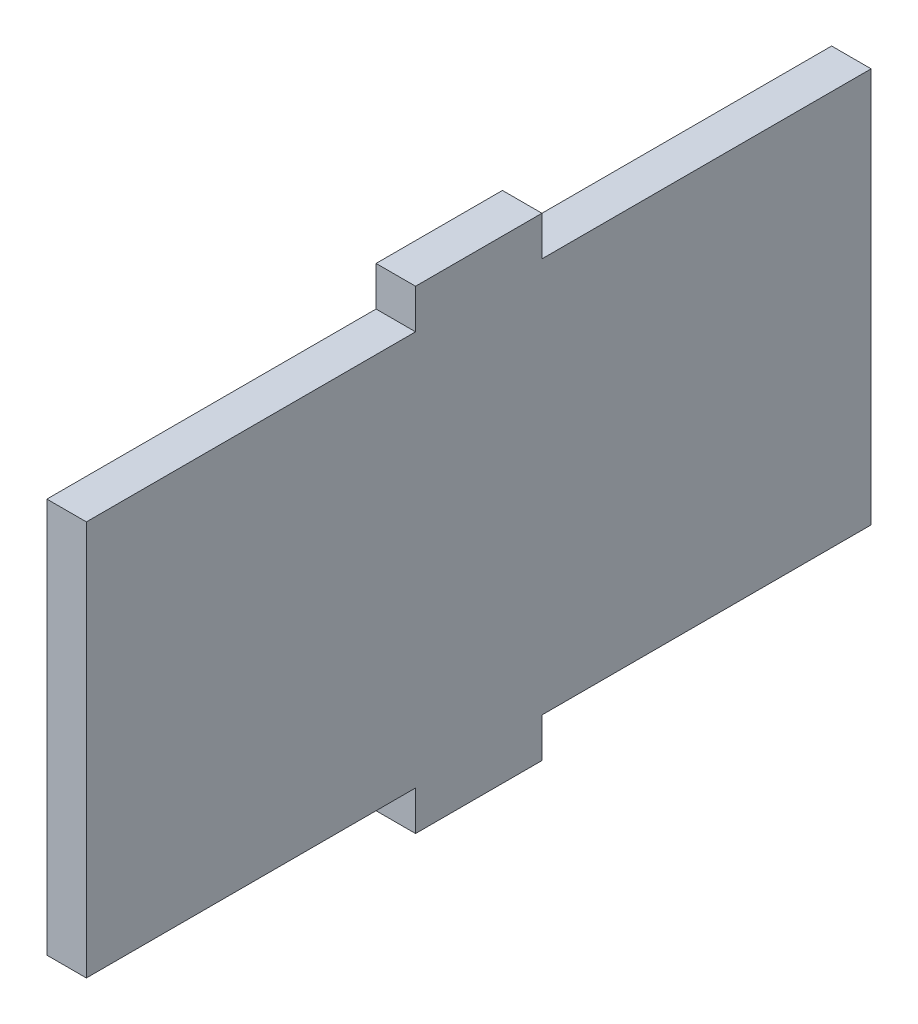
ISO-10303-21;
HEADER;
FILE_DESCRIPTION(('STEP AP214'),'2;1');
FILE_NAME('part.step','',(''),(''),'','','');
FILE_SCHEMA(('AUTOMOTIVE_DESIGN { 1 0 10303 214 1 1 1 1 }'));
ENDSEC;
DATA;
#1=APPLICATION_CONTEXT('core data for automotive mechanical design processes');
#2=APPLICATION_PROTOCOL_DEFINITION('international standard','automotive_design',2000,#1);
#3=PRODUCT_CONTEXT('',#1,'mechanical');
#4=PRODUCT('Part','Part','',(#3));
#5=PRODUCT_RELATED_PRODUCT_CATEGORY('part','',(#4));
#6=PRODUCT_DEFINITION_FORMATION('','',#4);
#7=PRODUCT_DEFINITION_CONTEXT('part definition',#1,'design');
#8=PRODUCT_DEFINITION('design','',#6,#7);
#9=PRODUCT_DEFINITION_SHAPE('','',#8);
#10=(LENGTH_UNIT() NAMED_UNIT(*) SI_UNIT(.MILLI.,.METRE.));
#11=(NAMED_UNIT(*) PLANE_ANGLE_UNIT() SI_UNIT($,.RADIAN.));
#12=(NAMED_UNIT(*) SI_UNIT($,.STERADIAN.) SOLID_ANGLE_UNIT());
#13=UNCERTAINTY_MEASURE_WITH_UNIT(LENGTH_MEASURE(1.E-05),#10,'distance_accuracy_value','');
#14=(GEOMETRIC_REPRESENTATION_CONTEXT(3) GLOBAL_UNCERTAINTY_ASSIGNED_CONTEXT((#13)) GLOBAL_UNIT_ASSIGNED_CONTEXT((#10,
#11,#12)) REPRESENTATION_CONTEXT('',''));
#15=CARTESIAN_POINT('',(0.,0.,0.));
#16=DIRECTION('',(0.,0.,1.));
#17=DIRECTION('',(1.,0.,0.));
#18=AXIS2_PLACEMENT_3D('',#15,#16,#17);
#19=CARTESIAN_POINT('',(3.,41.,-4.8));
#20=DIRECTION('',(0.,-1.,0.));
#21=DIRECTION('',(0.,0.,-1.));
#22=AXIS2_PLACEMENT_3D('',#19,#20,#21);
#23=PLANE('',#22);
#24=DIRECTION('',(0.,0.,1.));
#25=VECTOR('',#24,1.);
#26=CARTESIAN_POINT('',(0.,41.,-4.8));
#27=LINE('',#26,#25);
#28=CARTESIAN_POINT('',(0.,41.,-4.8));
#29=VERTEX_POINT('',#28);
#30=CARTESIAN_POINT('',(0.,41.,4.8));
#31=VERTEX_POINT('',#30);
#32=EDGE_CURVE('E157',#29,#31,#27,.T.);
#33=ORIENTED_EDGE('',*,*,#32,.T.);
#34=DIRECTION('',(-1.,0.,0.));
#35=VECTOR('',#34,1.);
#36=CARTESIAN_POINT('',(3.,41.,4.8));
#37=LINE('',#36,#35);
#38=CARTESIAN_POINT('',(3.,41.,4.8));
#39=VERTEX_POINT('',#38);
#40=EDGE_CURVE('E11',#39,#31,#37,.T.);
#41=ORIENTED_EDGE('',*,*,#40,.F.);
#42=DIRECTION('',(0.,0.,1.));
#43=VECTOR('',#42,1.);
#44=CARTESIAN_POINT('',(3.,41.,-4.8));
#45=LINE('',#44,#43);
#46=CARTESIAN_POINT('',(3.,41.,-4.8));
#47=VERTEX_POINT('',#46);
#48=EDGE_CURVE('E179',#47,#39,#45,.T.);
#49=ORIENTED_EDGE('',*,*,#48,.F.);
#50=DIRECTION('',(-1.,0.,0.));
#51=VECTOR('',#50,1.);
#52=CARTESIAN_POINT('',(3.,41.,-4.8));
#53=LINE('',#52,#51);
#54=EDGE_CURVE('E153',#47,#29,#53,.T.);
#55=ORIENTED_EDGE('',*,*,#54,.T.);
#56=EDGE_LOOP('',(#33,#41,#49,#55));
#57=FACE_BOUND('',#56,.T.);
#58=ADVANCED_FACE('F37',(#57),#23,.F.);
#59=CARTESIAN_POINT('',(3.,41.,4.8));
#60=DIRECTION('',(0.,0.,-1.));
#61=DIRECTION('',(-1.,0.,0.));
#62=AXIS2_PLACEMENT_3D('',#59,#60,#61);
#63=PLANE('',#62);
#64=DIRECTION('',(0.,-1.,0.));
#65=VECTOR('',#64,1.);
#66=CARTESIAN_POINT('',(0.,41.,4.8));
#67=LINE('',#66,#65);
#68=CARTESIAN_POINT('',(0.,38.,4.8));
#69=VERTEX_POINT('',#68);
#70=EDGE_CURVE('E160',#31,#69,#67,.T.);
#71=ORIENTED_EDGE('',*,*,#70,.T.);
#72=DIRECTION('',(-1.,0.,0.));
#73=VECTOR('',#72,1.);
#74=CARTESIAN_POINT('',(3.,38.,4.8));
#75=LINE('',#74,#73);
#76=CARTESIAN_POINT('',(3.,38.,4.8));
#77=VERTEX_POINT('',#76);
#78=EDGE_CURVE('E45',#77,#69,#75,.T.);
#79=ORIENTED_EDGE('',*,*,#78,.F.);
#80=DIRECTION('',(0.,-1.,0.));
#81=VECTOR('',#80,1.);
#82=CARTESIAN_POINT('',(3.,41.,4.8));
#83=LINE('',#82,#81);
#84=EDGE_CURVE('E108',#39,#77,#83,.T.);
#85=ORIENTED_EDGE('',*,*,#84,.F.);
#86=ORIENTED_EDGE('',*,*,#40,.T.);
#87=EDGE_LOOP('',(#71,#79,#85,#86));
#88=FACE_BOUND('',#87,.T.);
#89=ADVANCED_FACE('F257',(#88),#63,.F.);
#90=CARTESIAN_POINT('',(3.,38.,4.8));
#91=DIRECTION('',(0.,-1.,0.));
#92=DIRECTION('',(0.,0.,-1.));
#93=AXIS2_PLACEMENT_3D('',#90,#91,#92);
#94=PLANE('',#93);
#95=DIRECTION('',(0.,0.,1.));
#96=VECTOR('',#95,1.);
#97=CARTESIAN_POINT('',(0.,38.,4.8));
#98=LINE('',#97,#96);
#99=CARTESIAN_POINT('',(0.,38.,29.8));
#100=VERTEX_POINT('',#99);
#101=EDGE_CURVE('E162',#69,#100,#98,.T.);
#102=ORIENTED_EDGE('',*,*,#101,.T.);
#103=DIRECTION('',(-1.,0.,0.));
#104=VECTOR('',#103,1.);
#105=CARTESIAN_POINT('',(3.,38.,29.8));
#106=LINE('',#105,#104);
#107=CARTESIAN_POINT('',(3.,38.,29.8));
#108=VERTEX_POINT('',#107);
#109=EDGE_CURVE('E198',#108,#100,#106,.T.);
#110=ORIENTED_EDGE('',*,*,#109,.F.);
#111=DIRECTION('',(0.,0.,1.));
#112=VECTOR('',#111,1.);
#113=CARTESIAN_POINT('',(3.,38.,4.8));
#114=LINE('',#113,#112);
#115=EDGE_CURVE('E206',#77,#108,#114,.T.);
#116=ORIENTED_EDGE('',*,*,#115,.F.);
#117=ORIENTED_EDGE('',*,*,#78,.T.);
#118=EDGE_LOOP('',(#102,#110,#116,#117));
#119=FACE_BOUND('',#118,.T.);
#120=ADVANCED_FACE('F204',(#119),#94,.F.);
#121=CARTESIAN_POINT('',(3.,7.99999999999999,29.8));
#122=DIRECTION('',(0.,0.,-1.));
#123=DIRECTION('',(-1.,0.,0.));
#124=AXIS2_PLACEMENT_3D('',#121,#122,#123);
#125=PLANE('',#124);
#126=DIRECTION('',(0.,-1.,0.));
#127=VECTOR('',#126,1.);
#128=CARTESIAN_POINT('',(0.,7.99999999999999,29.8));
#129=LINE('',#128,#127);
#130=CARTESIAN_POINT('',(0.,7.99999999999999,29.8));
#131=VERTEX_POINT('',#130);
#132=EDGE_CURVE('E164',#100,#131,#129,.T.);
#133=ORIENTED_EDGE('',*,*,#132,.T.);
#134=DIRECTION('',(-1.,0.,0.));
#135=VECTOR('',#134,1.);
#136=CARTESIAN_POINT('',(3.,7.99999999999999,29.8));
#137=LINE('',#136,#135);
#138=CARTESIAN_POINT('',(3.,7.99999999999999,29.8));
#139=VERTEX_POINT('',#138);
#140=EDGE_CURVE('E195',#139,#131,#137,.T.);
#141=ORIENTED_EDGE('',*,*,#140,.F.);
#142=DIRECTION('',(0.,-1.,0.));
#143=VECTOR('',#142,1.);
#144=CARTESIAN_POINT('',(3.,7.99999999999999,29.8));
#145=LINE('',#144,#143);
#146=EDGE_CURVE('E224',#108,#139,#145,.T.);
#147=ORIENTED_EDGE('',*,*,#146,.F.);
#148=ORIENTED_EDGE('',*,*,#109,.T.);
#149=EDGE_LOOP('',(#133,#141,#147,#148));
#150=FACE_BOUND('',#149,.T.);
#151=ADVANCED_FACE('F215',(#150),#125,.F.);
#152=CARTESIAN_POINT('',(3.,7.99999999999999,4.8));
#153=DIRECTION('',(0.,1.,0.));
#154=DIRECTION('',(0.,0.,1.));
#155=AXIS2_PLACEMENT_3D('',#152,#153,#154);
#156=PLANE('',#155);
#157=DIRECTION('',(0.,0.,-1.));
#158=VECTOR('',#157,1.);
#159=CARTESIAN_POINT('',(0.,7.99999999999999,4.8));
#160=LINE('',#159,#158);
#161=CARTESIAN_POINT('',(0.,7.99999999999999,4.8));
#162=VERTEX_POINT('',#161);
#163=EDGE_CURVE('E166',#131,#162,#160,.T.);
#164=ORIENTED_EDGE('',*,*,#163,.T.);
#165=DIRECTION('',(-1.,0.,0.));
#166=VECTOR('',#165,1.);
#167=CARTESIAN_POINT('',(3.,7.99999999999999,4.8));
#168=LINE('',#167,#166);
#169=CARTESIAN_POINT('',(3.,7.99999999999999,4.8));
#170=VERTEX_POINT('',#169);
#171=EDGE_CURVE('E192',#170,#162,#168,.T.);
#172=ORIENTED_EDGE('',*,*,#171,.F.);
#173=DIRECTION('',(0.,0.,-1.));
#174=VECTOR('',#173,1.);
#175=CARTESIAN_POINT('',(3.,7.99999999999999,4.8));
#176=LINE('',#175,#174);
#177=EDGE_CURVE('E221',#139,#170,#176,.T.);
#178=ORIENTED_EDGE('',*,*,#177,.F.);
#179=ORIENTED_EDGE('',*,*,#140,.T.);
#180=EDGE_LOOP('',(#164,#172,#178,#179));
#181=FACE_BOUND('',#180,.T.);
#182=ADVANCED_FACE('F219',(#181),#156,.F.);
#183=CARTESIAN_POINT('',(3.,4.99999999999999,4.8));
#184=DIRECTION('',(0.,0.,-1.));
#185=DIRECTION('',(-1.,0.,0.));
#186=AXIS2_PLACEMENT_3D('',#183,#184,#185);
#187=PLANE('',#186);
#188=DIRECTION('',(0.,-1.,0.));
#189=VECTOR('',#188,1.);
#190=CARTESIAN_POINT('',(0.,4.99999999999999,4.8));
#191=LINE('',#190,#189);
#192=CARTESIAN_POINT('',(0.,4.99999999999999,4.8));
#193=VERTEX_POINT('',#192);
#194=EDGE_CURVE('E168',#162,#193,#191,.T.);
#195=ORIENTED_EDGE('',*,*,#194,.T.);
#196=DIRECTION('',(-1.,0.,0.));
#197=VECTOR('',#196,1.);
#198=CARTESIAN_POINT('',(3.,4.99999999999999,4.8));
#199=LINE('',#198,#197);
#200=CARTESIAN_POINT('',(3.,4.99999999999999,4.8));
#201=VERTEX_POINT('',#200);
#202=EDGE_CURVE('E189',#201,#193,#199,.T.);
#203=ORIENTED_EDGE('',*,*,#202,.F.);
#204=DIRECTION('',(0.,-1.,0.));
#205=VECTOR('',#204,1.);
#206=CARTESIAN_POINT('',(3.,4.99999999999999,4.8));
#207=LINE('',#206,#205);
#208=EDGE_CURVE('E223',#170,#201,#207,.T.);
#209=ORIENTED_EDGE('',*,*,#208,.F.);
#210=ORIENTED_EDGE('',*,*,#171,.T.);
#211=EDGE_LOOP('',(#195,#203,#209,#210));
#212=FACE_BOUND('',#211,.T.);
#213=ADVANCED_FACE('F270',(#212),#187,.F.);
#214=CARTESIAN_POINT('',(3.,5.,-4.8));
#215=DIRECTION('',(0.,1.,0.));
#216=DIRECTION('',(0.,0.,1.));
#217=AXIS2_PLACEMENT_3D('',#214,#215,#216);
#218=PLANE('',#217);
#219=DIRECTION('',(0.,0.,-1.));
#220=VECTOR('',#219,1.);
#221=CARTESIAN_POINT('',(0.,5.,-4.8));
#222=LINE('',#221,#220);
#223=CARTESIAN_POINT('',(0.,5.,-4.8));
#224=VERTEX_POINT('',#223);
#225=EDGE_CURVE('E170',#193,#224,#222,.T.);
#226=ORIENTED_EDGE('',*,*,#225,.T.);
#227=DIRECTION('',(-1.,0.,0.));
#228=VECTOR('',#227,1.);
#229=CARTESIAN_POINT('',(3.,5.,-4.8));
#230=LINE('',#229,#228);
#231=CARTESIAN_POINT('',(3.,5.,-4.8));
#232=VERTEX_POINT('',#231);
#233=EDGE_CURVE('E186',#232,#224,#230,.T.);
#234=ORIENTED_EDGE('',*,*,#233,.F.);
#235=DIRECTION('',(0.,0.,-1.));
#236=VECTOR('',#235,1.);
#237=CARTESIAN_POINT('',(3.,5.,-4.8));
#238=LINE('',#237,#236);
#239=EDGE_CURVE('E226',#201,#232,#238,.T.);
#240=ORIENTED_EDGE('',*,*,#239,.F.);
#241=ORIENTED_EDGE('',*,*,#202,.T.);
#242=EDGE_LOOP('',(#226,#234,#240,#241));
#243=FACE_BOUND('',#242,.T.);
#244=ADVANCED_FACE('F273',(#243),#218,.F.);
#245=CARTESIAN_POINT('',(3.,5.,-4.8));
#246=DIRECTION('',(0.,0.,1.));
#247=DIRECTION('',(1.,0.,0.));
#248=AXIS2_PLACEMENT_3D('',#245,#246,#247);
#249=PLANE('',#248);
#250=DIRECTION('',(0.,1.,0.));
#251=VECTOR('',#250,1.);
#252=CARTESIAN_POINT('',(0.,5.,-4.8));
#253=LINE('',#252,#251);
#254=CARTESIAN_POINT('',(0.,8.,-4.8));
#255=VERTEX_POINT('',#254);
#256=EDGE_CURVE('E172',#224,#255,#253,.T.);
#257=ORIENTED_EDGE('',*,*,#256,.T.);
#258=DIRECTION('',(-1.,0.,0.));
#259=VECTOR('',#258,1.);
#260=CARTESIAN_POINT('',(3.,8.,-4.8));
#261=LINE('',#260,#259);
#262=CARTESIAN_POINT('',(3.,8.,-4.8));
#263=VERTEX_POINT('',#262);
#264=EDGE_CURVE('E183',#263,#255,#261,.T.);
#265=ORIENTED_EDGE('',*,*,#264,.F.);
#266=DIRECTION('',(0.,1.,0.));
#267=VECTOR('',#266,1.);
#268=CARTESIAN_POINT('',(3.,5.,-4.8));
#269=LINE('',#268,#267);
#270=EDGE_CURVE('E232',#232,#263,#269,.T.);
#271=ORIENTED_EDGE('',*,*,#270,.F.);
#272=ORIENTED_EDGE('',*,*,#233,.T.);
#273=EDGE_LOOP('',(#257,#265,#271,#272));
#274=FACE_BOUND('',#273,.T.);
#275=ADVANCED_FACE('F238',(#274),#249,.F.);
#276=CARTESIAN_POINT('',(3.,8.,-4.8));
#277=DIRECTION('',(0.,1.,0.));
#278=DIRECTION('',(0.,0.,1.));
#279=AXIS2_PLACEMENT_3D('',#276,#277,#278);
#280=PLANE('',#279);
#281=DIRECTION('',(0.,0.,-1.));
#282=VECTOR('',#281,1.);
#283=CARTESIAN_POINT('',(0.,8.,-4.8));
#284=LINE('',#283,#282);
#285=CARTESIAN_POINT('',(0.,8.,-29.8));
#286=VERTEX_POINT('',#285);
#287=EDGE_CURVE('E174',#255,#286,#284,.T.);
#288=ORIENTED_EDGE('',*,*,#287,.T.);
#289=DIRECTION('',(-1.,0.,0.));
#290=VECTOR('',#289,1.);
#291=CARTESIAN_POINT('',(3.,8.,-29.8));
#292=LINE('',#291,#290);
#293=CARTESIAN_POINT('',(3.,8.,-29.8));
#294=VERTEX_POINT('',#293);
#295=EDGE_CURVE('E148',#294,#286,#292,.T.);
#296=ORIENTED_EDGE('',*,*,#295,.F.);
#297=DIRECTION('',(0.,0.,-1.));
#298=VECTOR('',#297,1.);
#299=CARTESIAN_POINT('',(3.,8.,-4.8));
#300=LINE('',#299,#298);
#301=EDGE_CURVE('E139',#263,#294,#300,.T.);
#302=ORIENTED_EDGE('',*,*,#301,.F.);
#303=ORIENTED_EDGE('',*,*,#264,.T.);
#304=EDGE_LOOP('',(#288,#296,#302,#303));
#305=FACE_BOUND('',#304,.T.);
#306=ADVANCED_FACE('F242',(#305),#280,.F.);
#307=CARTESIAN_POINT('',(3.,8.,-29.8));
#308=DIRECTION('',(0.,0.,1.));
#309=DIRECTION('',(1.,0.,0.));
#310=AXIS2_PLACEMENT_3D('',#307,#308,#309);
#311=PLANE('',#310);
#312=DIRECTION('',(0.,1.,0.));
#313=VECTOR('',#312,1.);
#314=CARTESIAN_POINT('',(0.,8.,-29.8));
#315=LINE('',#314,#313);
#316=CARTESIAN_POINT('',(0.,38.,-29.8));
#317=VERTEX_POINT('',#316);
#318=EDGE_CURVE('E147',#286,#317,#315,.T.);
#319=ORIENTED_EDGE('',*,*,#318,.T.);
#320=DIRECTION('',(-1.,0.,0.));
#321=VECTOR('',#320,1.);
#322=CARTESIAN_POINT('',(3.,38.,-29.8));
#323=LINE('',#322,#321);
#324=CARTESIAN_POINT('',(3.,38.,-29.8));
#325=VERTEX_POINT('',#324);
#326=EDGE_CURVE('E144',#325,#317,#323,.T.);
#327=ORIENTED_EDGE('',*,*,#326,.F.);
#328=DIRECTION('',(0.,1.,0.));
#329=VECTOR('',#328,1.);
#330=CARTESIAN_POINT('',(3.,8.,-29.8));
#331=LINE('',#330,#329);
#332=EDGE_CURVE('E133',#294,#325,#331,.T.);
#333=ORIENTED_EDGE('',*,*,#332,.F.);
#334=ORIENTED_EDGE('',*,*,#295,.T.);
#335=EDGE_LOOP('',(#319,#327,#333,#334));
#336=FACE_BOUND('',#335,.T.);
#337=ADVANCED_FACE('F145',(#336),#311,.F.);
#338=CARTESIAN_POINT('',(3.,38.,-4.8));
#339=DIRECTION('',(0.,-1.,0.));
#340=DIRECTION('',(0.,0.,-1.));
#341=AXIS2_PLACEMENT_3D('',#338,#339,#340);
#342=PLANE('',#341);
#343=DIRECTION('',(0.,0.,1.));
#344=VECTOR('',#343,1.);
#345=CARTESIAN_POINT('',(0.,38.,-4.8));
#346=LINE('',#345,#344);
#347=CARTESIAN_POINT('',(0.,38.,-4.8));
#348=VERTEX_POINT('',#347);
#349=EDGE_CURVE('E94',#317,#348,#346,.T.);
#350=ORIENTED_EDGE('',*,*,#349,.T.);
#351=DIRECTION('',(-1.,0.,0.));
#352=VECTOR('',#351,1.);
#353=CARTESIAN_POINT('',(3.,38.,-4.8));
#354=LINE('',#353,#352);
#355=CARTESIAN_POINT('',(3.,38.,-4.8));
#356=VERTEX_POINT('',#355);
#357=EDGE_CURVE('E149',#356,#348,#354,.T.);
#358=ORIENTED_EDGE('',*,*,#357,.F.);
#359=DIRECTION('',(0.,0.,1.));
#360=VECTOR('',#359,1.);
#361=CARTESIAN_POINT('',(3.,38.,-4.8));
#362=LINE('',#361,#360);
#363=EDGE_CURVE('E137',#325,#356,#362,.T.);
#364=ORIENTED_EDGE('',*,*,#363,.F.);
#365=ORIENTED_EDGE('',*,*,#326,.T.);
#366=EDGE_LOOP('',(#350,#358,#364,#365));
#367=FACE_BOUND('',#366,.T.);
#368=ADVANCED_FACE('F151',(#367),#342,.F.);
#369=CARTESIAN_POINT('',(3.,41.,-4.8));
#370=DIRECTION('',(0.,0.,1.));
#371=DIRECTION('',(1.,0.,0.));
#372=AXIS2_PLACEMENT_3D('',#369,#370,#371);
#373=PLANE('',#372);
#374=DIRECTION('',(0.,1.,0.));
#375=VECTOR('',#374,1.);
#376=CARTESIAN_POINT('',(0.,41.,-4.8));
#377=LINE('',#376,#375);
#378=EDGE_CURVE('E100',#348,#29,#377,.T.);
#379=ORIENTED_EDGE('',*,*,#378,.T.);
#380=ORIENTED_EDGE('',*,*,#54,.F.);
#381=DIRECTION('',(0.,1.,0.));
#382=VECTOR('',#381,1.);
#383=CARTESIAN_POINT('',(3.,41.,-4.8));
#384=LINE('',#383,#382);
#385=EDGE_CURVE('E53',#356,#47,#384,.T.);
#386=ORIENTED_EDGE('',*,*,#385,.F.);
#387=ORIENTED_EDGE('',*,*,#357,.T.);
#388=EDGE_LOOP('',(#379,#380,#386,#387));
#389=FACE_BOUND('',#388,.T.);
#390=ADVANCED_FACE('F246',(#389),#373,.F.);
#391=CARTESIAN_POINT('',(3.,0.,0.));
#392=DIRECTION('',(1.,0.,0.));
#393=DIRECTION('',(0.,0.,-1.));
#394=AXIS2_PLACEMENT_3D('',#391,#392,#393);
#395=PLANE('',#394);
#396=ORIENTED_EDGE('',*,*,#48,.T.);
#397=ORIENTED_EDGE('',*,*,#84,.T.);
#398=ORIENTED_EDGE('',*,*,#115,.T.);
#399=ORIENTED_EDGE('',*,*,#146,.T.);
#400=ORIENTED_EDGE('',*,*,#177,.T.);
#401=ORIENTED_EDGE('',*,*,#208,.T.);
#402=ORIENTED_EDGE('',*,*,#239,.T.);
#403=ORIENTED_EDGE('',*,*,#270,.T.);
#404=ORIENTED_EDGE('',*,*,#301,.T.);
#405=ORIENTED_EDGE('',*,*,#332,.T.);
#406=ORIENTED_EDGE('',*,*,#363,.T.);
#407=ORIENTED_EDGE('',*,*,#385,.T.);
#408=EDGE_LOOP('',(#396,#397,#398,#399,#400,#401,#402,#403,#404,#405,#406,#407));
#409=FACE_BOUND('',#408,.T.);
#410=ADVANCED_FACE('F135',(#409),#395,.T.);
#411=CARTESIAN_POINT('',(0.,0.,0.));
#412=DIRECTION('',(1.,0.,0.));
#413=DIRECTION('',(0.,0.,-1.));
#414=AXIS2_PLACEMENT_3D('',#411,#412,#413);
#415=PLANE('',#414);
#416=ORIENTED_EDGE('',*,*,#32,.F.);
#417=ORIENTED_EDGE('',*,*,#378,.F.);
#418=ORIENTED_EDGE('',*,*,#349,.F.);
#419=ORIENTED_EDGE('',*,*,#318,.F.);
#420=ORIENTED_EDGE('',*,*,#287,.F.);
#421=ORIENTED_EDGE('',*,*,#256,.F.);
#422=ORIENTED_EDGE('',*,*,#225,.F.);
#423=ORIENTED_EDGE('',*,*,#194,.F.);
#424=ORIENTED_EDGE('',*,*,#163,.F.);
#425=ORIENTED_EDGE('',*,*,#132,.F.);
#426=ORIENTED_EDGE('',*,*,#101,.F.);
#427=ORIENTED_EDGE('',*,*,#70,.F.);
#428=EDGE_LOOP('',(#416,#417,#418,#419,#420,#421,#422,#423,#424,#425,#426,#427));
#429=FACE_BOUND('',#428,.T.);
#430=ADVANCED_FACE('F210',(#429),#415,.F.);
#431=CLOSED_SHELL('',(#58,#89,#120,#151,#182,#213,#244,#275,#306,#337,#368,#390,#410,#430));
#432=MANIFOLD_SOLID_BREP('B2',#431);
#433=ADVANCED_BREP_SHAPE_REPRESENTATION('',(#18,#432),#14);
#434=SHAPE_DEFINITION_REPRESENTATION(#9,#433);
ENDSEC;
END-ISO-10303-21;
